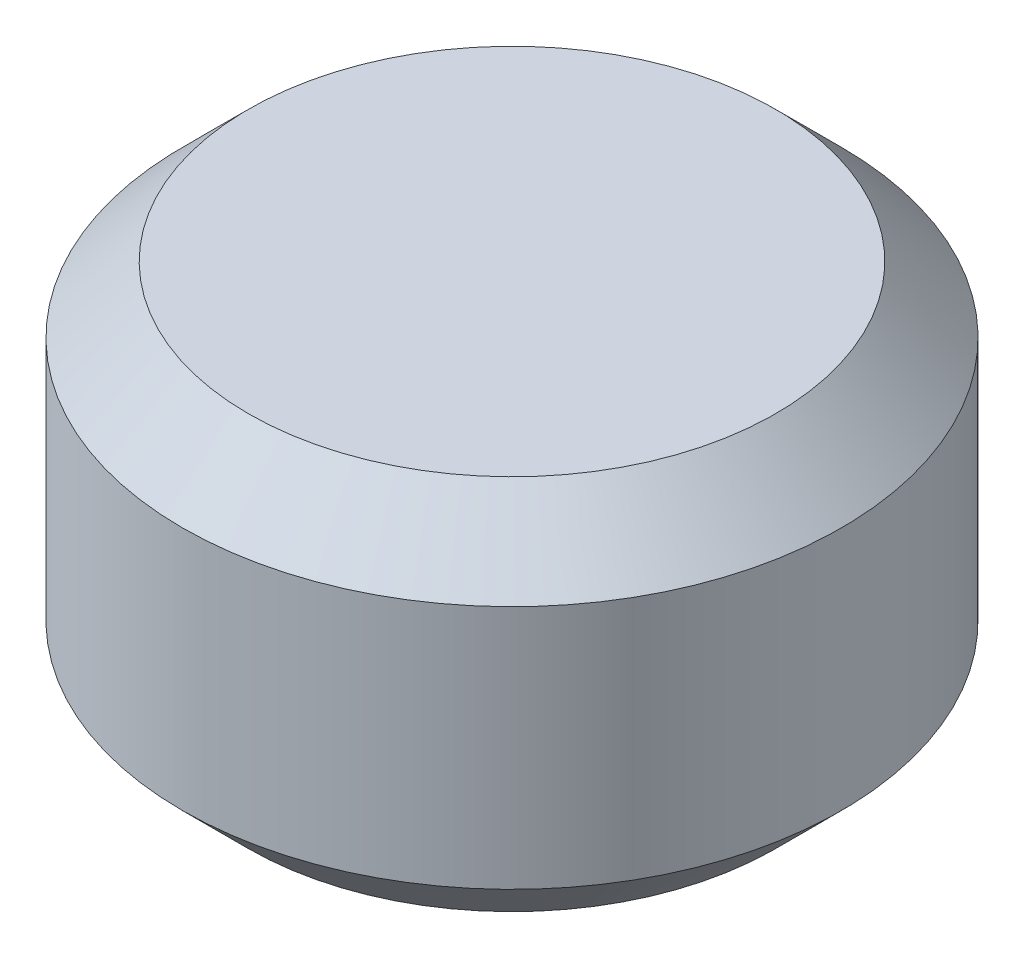
ISO-10303-21;
HEADER;
FILE_DESCRIPTION(('STEP AP214'),'2;1');
FILE_NAME('part.step','',(''),(''),'','','');
FILE_SCHEMA(('AUTOMOTIVE_DESIGN { 1 0 10303 214 1 1 1 1 }'));
ENDSEC;
DATA;
#1=APPLICATION_CONTEXT('core data for automotive mechanical design processes');
#2=APPLICATION_PROTOCOL_DEFINITION('international standard','automotive_design',2000,#1);
#3=PRODUCT_CONTEXT('',#1,'mechanical');
#4=PRODUCT('Part','Part','',(#3));
#5=PRODUCT_RELATED_PRODUCT_CATEGORY('part','',(#4));
#6=PRODUCT_DEFINITION_FORMATION('','',#4);
#7=PRODUCT_DEFINITION_CONTEXT('part definition',#1,'design');
#8=PRODUCT_DEFINITION('design','',#6,#7);
#9=PRODUCT_DEFINITION_SHAPE('','',#8);
#10=(LENGTH_UNIT() NAMED_UNIT(*) SI_UNIT(.MILLI.,.METRE.));
#11=(NAMED_UNIT(*) PLANE_ANGLE_UNIT() SI_UNIT($,.RADIAN.));
#12=(NAMED_UNIT(*) SI_UNIT($,.STERADIAN.) SOLID_ANGLE_UNIT());
#13=UNCERTAINTY_MEASURE_WITH_UNIT(LENGTH_MEASURE(1.E-05),#10,'distance_accuracy_value','');
#14=(GEOMETRIC_REPRESENTATION_CONTEXT(3) GLOBAL_UNCERTAINTY_ASSIGNED_CONTEXT((#13)) GLOBAL_UNIT_ASSIGNED_CONTEXT((#10,
#11,#12)) REPRESENTATION_CONTEXT('',''));
#15=CARTESIAN_POINT('',(0.,0.,0.));
#16=DIRECTION('',(0.,0.,1.));
#17=DIRECTION('',(1.,0.,0.));
#18=AXIS2_PLACEMENT_3D('',#15,#16,#17);
#19=CARTESIAN_POINT('',(0.,2.,0.));
#20=DIRECTION('',(0.,-1.,0.));
#21=DIRECTION('',(0.,0.,-1.));
#22=AXIS2_PLACEMENT_3D('',#19,#20,#21);
#23=CYLINDRICAL_SURFACE('',#22,1.75);
#24=CARTESIAN_POINT('',(0.,0.35,0.));
#25=DIRECTION('',(0.,1.,0.));
#26=DIRECTION('',(0.,0.,1.));
#27=AXIS2_PLACEMENT_3D('',#24,#25,#26);
#28=CIRCLE('',#27,1.75);
#29=CARTESIAN_POINT('',(0.,0.35,1.75));
#30=VERTEX_POINT('',#29);
#31=EDGE_CURVE('E59',#30,#30,#28,.T.);
#32=ORIENTED_EDGE('',*,*,#31,.T.);
#33=EDGE_LOOP('',(#32));
#34=FACE_BOUND('',#33,.T.);
#35=CARTESIAN_POINT('',(0.,1.65,0.));
#36=DIRECTION('',(0.,1.,0.));
#37=DIRECTION('',(0.,0.,1.));
#38=AXIS2_PLACEMENT_3D('',#35,#36,#37);
#39=CIRCLE('',#38,1.75);
#40=CARTESIAN_POINT('',(0.,1.65,1.75));
#41=VERTEX_POINT('',#40);
#42=EDGE_CURVE('E64',#41,#41,#39,.F.);
#43=ORIENTED_EDGE('',*,*,#42,.T.);
#44=EDGE_LOOP('',(#43));
#45=FACE_BOUND('',#44,.T.);
#46=ADVANCED_FACE('F45',(#34,#45),#23,.T.);
#47=CARTESIAN_POINT('',(0.,2.,0.));
#48=DIRECTION('',(0.,1.,0.));
#49=DIRECTION('',(0.,0.,1.));
#50=AXIS2_PLACEMENT_3D('',#47,#48,#49);
#51=PLANE('',#50);
#52=CARTESIAN_POINT('',(0.,2.,0.));
#53=DIRECTION('',(0.,1.,0.));
#54=DIRECTION('',(0.,0.,1.));
#55=AXIS2_PLACEMENT_3D('',#52,#53,#54);
#56=CIRCLE('',#55,1.4);
#57=CARTESIAN_POINT('',(0.,2.,1.4));
#58=VERTEX_POINT('',#57);
#59=EDGE_CURVE('E10',#58,#58,#56,.T.);
#60=ORIENTED_EDGE('',*,*,#59,.T.);
#61=EDGE_LOOP('',(#60));
#62=FACE_BOUND('',#61,.T.);
#63=ADVANCED_FACE('F81',(#62),#51,.T.);
#64=CARTESIAN_POINT('',(0.,0.,0.));
#65=DIRECTION('',(0.,1.,0.));
#66=DIRECTION('',(0.,0.,1.));
#67=AXIS2_PLACEMENT_3D('',#64,#65,#66);
#68=PLANE('',#67);
#69=CARTESIAN_POINT('',(0.,0.,0.));
#70=DIRECTION('',(0.,1.,0.));
#71=DIRECTION('',(0.,0.,1.));
#72=AXIS2_PLACEMENT_3D('',#69,#70,#71);
#73=CIRCLE('',#72,1.4);
#74=CARTESIAN_POINT('',(0.,0.,1.4));
#75=VERTEX_POINT('',#74);
#76=EDGE_CURVE('E54',#75,#75,#73,.F.);
#77=ORIENTED_EDGE('',*,*,#76,.T.);
#78=EDGE_LOOP('',(#77));
#79=FACE_BOUND('',#78,.T.);
#80=ADVANCED_FACE('F78',(#79),#68,.F.);
#81=CARTESIAN_POINT('',(0.,0.35,0.));
#82=DIRECTION('',(0.,1.,0.));
#83=DIRECTION('',(0.,0.,1.));
#84=AXIS2_PLACEMENT_3D('',#81,#82,#83);
#85=CONICAL_SURFACE('',#84,1.75,0.78539816339745);
#86=CARTESIAN_POINT('',(0.,0.,1.4));
#87=CARTESIAN_POINT('',(0.,0.00364583333333322,1.40364583333333));
#88=CARTESIAN_POINT('',(0.,0.00729166666666657,1.40729166666667));
#89=CARTESIAN_POINT('',(0.,0.0145833333333333,1.41458333333333));
#90=CARTESIAN_POINT('',(0.,0.0182291666666666,1.41822916666667));
#91=CARTESIAN_POINT('',(0.,0.0255208333333333,1.42552083333333));
#92=CARTESIAN_POINT('',(0.,0.0291666666666666,1.42916666666667));
#93=CARTESIAN_POINT('',(0.,0.0364583333333332,1.43645833333333));
#94=CARTESIAN_POINT('',(0.,0.0401041666666666,1.44010416666667));
#95=CARTESIAN_POINT('',(0.,0.0473958333333332,1.44739583333333));
#96=CARTESIAN_POINT('',(0.,0.0510416666666666,1.45104166666667));
#97=CARTESIAN_POINT('',(0.,0.0583333333333332,1.45833333333333));
#98=CARTESIAN_POINT('',(0.,0.0619791666666666,1.46197916666667));
#99=CARTESIAN_POINT('',(0.,0.0692708333333332,1.46927083333333));
#100=CARTESIAN_POINT('',(0.,0.0729166666666665,1.47291666666667));
#101=CARTESIAN_POINT('',(0.,0.0802083333333332,1.48020833333333));
#102=CARTESIAN_POINT('',(0.,0.0838541666666665,1.48385416666667));
#103=CARTESIAN_POINT('',(0.,0.0911458333333332,1.49114583333333));
#104=CARTESIAN_POINT('',(0.,0.0947916666666665,1.49479166666667));
#105=CARTESIAN_POINT('',(0.,0.102083333333333,1.50208333333333));
#106=CARTESIAN_POINT('',(0.,0.105729166666666,1.50572916666667));
#107=CARTESIAN_POINT('',(0.,0.113020833333333,1.51302083333333));
#108=CARTESIAN_POINT('',(0.,0.116666666666666,1.51666666666667));
#109=CARTESIAN_POINT('',(0.,0.123958333333333,1.52395833333333));
#110=CARTESIAN_POINT('',(0.,0.127604166666666,1.52760416666667));
#111=CARTESIAN_POINT('',(0.,0.134895833333333,1.53489583333333));
#112=CARTESIAN_POINT('',(0.,0.138541666666666,1.53854166666667));
#113=CARTESIAN_POINT('',(0.,0.145833333333333,1.54583333333333));
#114=CARTESIAN_POINT('',(0.,0.149479166666666,1.54947916666667));
#115=CARTESIAN_POINT('',(0.,0.156770833333333,1.55677083333333));
#116=CARTESIAN_POINT('',(0.,0.160416666666666,1.56041666666667));
#117=CARTESIAN_POINT('',(0.,0.167708333333333,1.56770833333333));
#118=CARTESIAN_POINT('',(0.,0.171354166666666,1.57135416666667));
#119=CARTESIAN_POINT('',(0.,0.178645833333333,1.57864583333333));
#120=CARTESIAN_POINT('',(0.,0.182291666666666,1.58229166666667));
#121=CARTESIAN_POINT('',(0.,0.189583333333333,1.58958333333333));
#122=CARTESIAN_POINT('',(0.,0.193229166666666,1.59322916666667));
#123=CARTESIAN_POINT('',(0.,0.200520833333333,1.60052083333333));
#124=CARTESIAN_POINT('',(0.,0.204166666666666,1.60416666666667));
#125=CARTESIAN_POINT('',(0.,0.211458333333333,1.61145833333333));
#126=CARTESIAN_POINT('',(0.,0.215104166666666,1.61510416666667));
#127=CARTESIAN_POINT('',(0.,0.222395833333333,1.62239583333333));
#128=CARTESIAN_POINT('',(0.,0.226041666666666,1.62604166666667));
#129=CARTESIAN_POINT('',(0.,0.233333333333333,1.63333333333333));
#130=CARTESIAN_POINT('',(0.,0.236979166666666,1.63697916666667));
#131=CARTESIAN_POINT('',(0.,0.244270833333333,1.64427083333333));
#132=CARTESIAN_POINT('',(0.,0.247916666666666,1.64791666666667));
#133=CARTESIAN_POINT('',(0.,0.255208333333333,1.65520833333333));
#134=CARTESIAN_POINT('',(0.,0.258854166666666,1.65885416666667));
#135=CARTESIAN_POINT('',(0.,0.266145833333333,1.66614583333333));
#136=CARTESIAN_POINT('',(0.,0.269791666666666,1.66979166666667));
#137=CARTESIAN_POINT('',(0.,0.277083333333333,1.67708333333333));
#138=CARTESIAN_POINT('',(0.,0.280729166666666,1.68072916666667));
#139=CARTESIAN_POINT('',(0.,0.288020833333333,1.68802083333333));
#140=CARTESIAN_POINT('',(0.,0.291666666666666,1.69166666666667));
#141=CARTESIAN_POINT('',(0.,0.298958333333333,1.69895833333333));
#142=CARTESIAN_POINT('',(0.,0.302604166666666,1.70260416666667));
#143=CARTESIAN_POINT('',(0.,0.309895833333333,1.70989583333333));
#144=CARTESIAN_POINT('',(0.,0.313541666666666,1.71354166666667));
#145=CARTESIAN_POINT('',(0.,0.320833333333333,1.72083333333333));
#146=CARTESIAN_POINT('',(0.,0.324479166666666,1.72447916666667));
#147=CARTESIAN_POINT('',(0.,0.331770833333333,1.73177083333333));
#148=CARTESIAN_POINT('',(0.,0.335416666666666,1.73541666666667));
#149=CARTESIAN_POINT('',(0.,0.342708333333333,1.74270833333333));
#150=CARTESIAN_POINT('',(0.,0.346354166666666,1.74635416666667));
#151=CARTESIAN_POINT('',(0.,0.35,1.75));
#152=B_SPLINE_CURVE_WITH_KNOTS('',3,(#86,#87,#88,#89,#90,#91,#92,#93,#94,#95,#96,#97,#98,#99,
#100,#101,#102,#103,#104,#105,#106,#107,#108,#109,#110,#111,#112,#113,#114,#115,#116,#117,#118,
#119,#120,#121,#122,#123,#124,#125,#126,#127,#128,#129,#130,#131,#132,#133,#134,#135,#136,#137,
#138,#139,#140,#141,#142,#143,#144,#145,#146,#147,#148,#149,#150,#151),.UNSPECIFIED.,.F.,.F.,(4,
2,2,2,2,2,2,2,2,2,2,2,2,2,2,2,2,2,2,2,2,2,2,2,2,2,2,2,2,2,2,2,4),(0.,0.0154679608384558,
0.0309359216769114,0.0464038825153672,0.0618718433538228,0.0773398041922786,0.0928077650307344,
0.10827572586919,0.123743686707646,0.139211647546102,0.154679608384557,0.170147569223013,
0.185615530061469,0.201083490899925,0.21655145173838,0.232019412576836,0.247487373415292,
0.262955334253747,0.278423295092203,0.293891255930659,0.309359216769115,0.32482717760757,
0.340295138446026,0.355763099284482,0.371231060122938,0.386699020961393,0.402166981799849,
0.417634942638305,0.433102903476761,0.448570864315217,0.464038825153672,0.479506785992128,
0.494974746830584),.UNSPECIFIED.);
#153=EDGE_CURVE('BSEAM74',#75,#30,#152,.T.);
#154=ORIENTED_EDGE('',*,*,#76,.F.);
#155=ORIENTED_EDGE('',*,*,#31,.F.);
#156=ORIENTED_EDGE('',*,*,#153,.T.);
#157=ORIENTED_EDGE('',*,*,#153,.F.);
#158=EDGE_LOOP('',(#154,#156,#155,#157));
#159=FACE_BOUND('',#158,.T.);
#160=ADVANCED_FACE('F74',(#159),#85,.T.);
#161=CARTESIAN_POINT('',(0.,2.,0.));
#162=DIRECTION('',(0.,-1.,0.));
#163=DIRECTION('',(0.,0.,-1.));
#164=AXIS2_PLACEMENT_3D('',#161,#162,#163);
#165=CONICAL_SURFACE('',#164,1.4,0.785398163397446);
#166=ORIENTED_EDGE('',*,*,#42,.F.);
#167=EDGE_LOOP('',(#166));
#168=FACE_BOUND('',#167,.T.);
#169=ORIENTED_EDGE('',*,*,#59,.F.);
#170=EDGE_LOOP('',(#169));
#171=FACE_BOUND('',#170,.T.);
#172=ADVANCED_FACE('F48',(#168,#171),#165,.T.);
#173=CLOSED_SHELL('',(#46,#63,#80,#160,#172));
#174=MANIFOLD_SOLID_BREP('B2',#173);
#175=ADVANCED_BREP_SHAPE_REPRESENTATION('',(#18,#174),#14);
#176=SHAPE_DEFINITION_REPRESENTATION(#9,#175);
ENDSEC;
END-ISO-10303-21;
